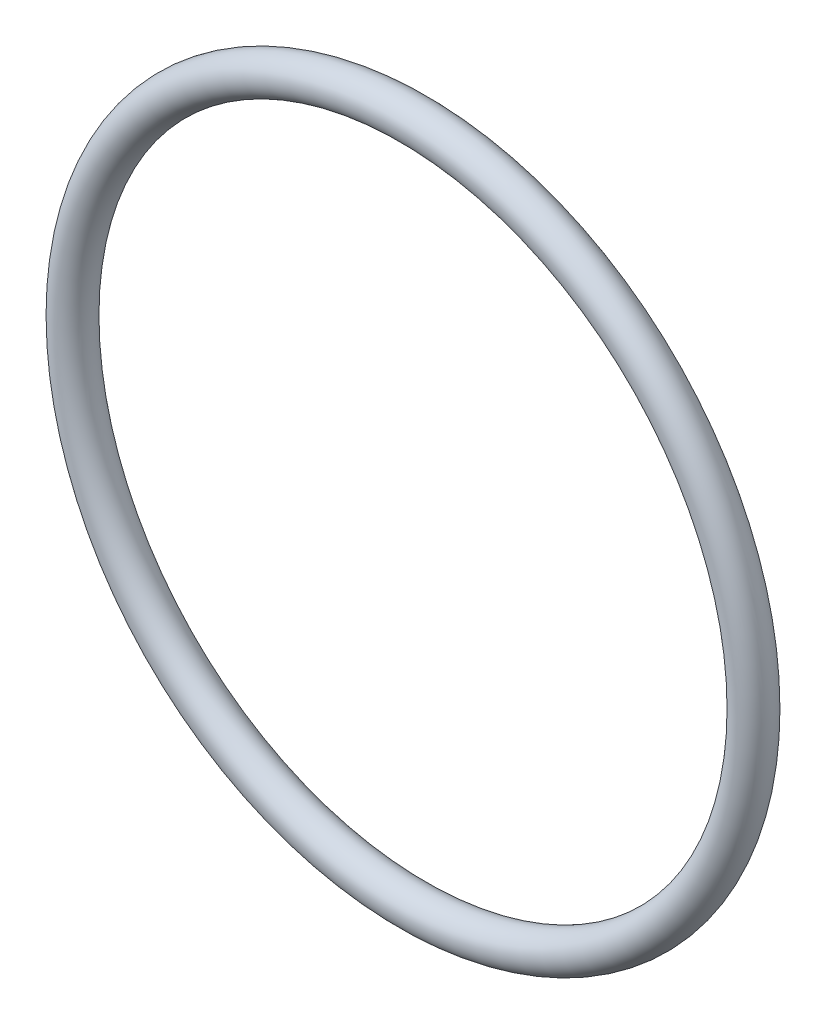
ISO-10303-21;
HEADER;
FILE_DESCRIPTION(('STEP AP214'),'2;1');
FILE_NAME('part.step','',(''),(''),'','','');
FILE_SCHEMA(('AUTOMOTIVE_DESIGN { 1 0 10303 214 1 1 1 1 }'));
ENDSEC;
DATA;
#1=APPLICATION_CONTEXT('core data for automotive mechanical design processes');
#2=APPLICATION_PROTOCOL_DEFINITION('international standard','automotive_design',2000,#1);
#3=PRODUCT_CONTEXT('',#1,'mechanical');
#4=PRODUCT('Part','Part','',(#3));
#5=PRODUCT_RELATED_PRODUCT_CATEGORY('part','',(#4));
#6=PRODUCT_DEFINITION_FORMATION('','',#4);
#7=PRODUCT_DEFINITION_CONTEXT('part definition',#1,'design');
#8=PRODUCT_DEFINITION('design','',#6,#7);
#9=PRODUCT_DEFINITION_SHAPE('','',#8);
#10=(LENGTH_UNIT() NAMED_UNIT(*) SI_UNIT(.MILLI.,.METRE.));
#11=(NAMED_UNIT(*) PLANE_ANGLE_UNIT() SI_UNIT($,.RADIAN.));
#12=(NAMED_UNIT(*) SI_UNIT($,.STERADIAN.) SOLID_ANGLE_UNIT());
#13=UNCERTAINTY_MEASURE_WITH_UNIT(LENGTH_MEASURE(1.E-05),#10,'distance_accuracy_value','');
#14=(GEOMETRIC_REPRESENTATION_CONTEXT(3) GLOBAL_UNCERTAINTY_ASSIGNED_CONTEXT((#13)) GLOBAL_UNIT_ASSIGNED_CONTEXT((#10,
#11,#12)) REPRESENTATION_CONTEXT('',''));
#15=CARTESIAN_POINT('',(0.,0.,0.));
#16=DIRECTION('',(0.,0.,1.));
#17=DIRECTION('',(1.,0.,0.));
#18=AXIS2_PLACEMENT_3D('',#15,#16,#17);
#19=CARTESIAN_POINT('',(11.557,0.,0.));
#20=DIRECTION('',(0.,0.,1.));
#21=DIRECTION('',(1.,0.,0.));
#22=AXIS2_PLACEMENT_3D('',#19,#20,#21);
#23=TOROIDAL_SURFACE('',#22,11.557,0.635);
#24=CARTESIAN_POINT('',(23.749,0.,0.));
#25=VERTEX_POINT('',#24);
#26=VERTEX_LOOP('',#25);
#27=FACE_BOUND('',#26,.T.);
#28=ADVANCED_FACE('F33',(#27),#23,.T.);
#29=CLOSED_SHELL('',(#28));
#30=MANIFOLD_SOLID_BREP('B2',#29);
#31=ADVANCED_BREP_SHAPE_REPRESENTATION('',(#18,#30),#14);
#32=SHAPE_DEFINITION_REPRESENTATION(#9,#31);
ENDSEC;
END-ISO-10303-21;
